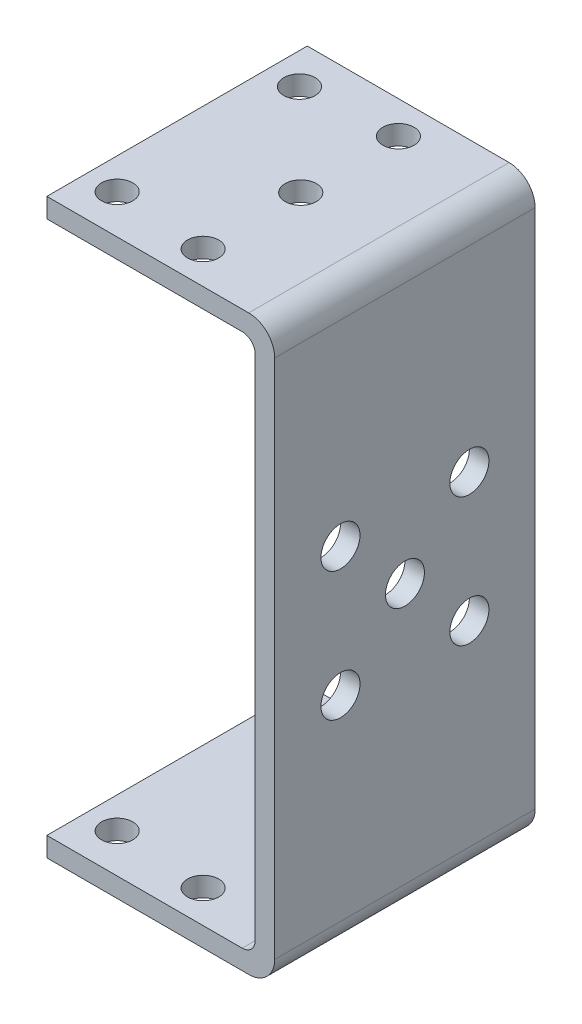
ISO-10303-21;
HEADER;
FILE_DESCRIPTION(('STEP AP214'),'2;1');
FILE_NAME('part.step','',(''),(''),'','','');
FILE_SCHEMA(('AUTOMOTIVE_DESIGN { 1 0 10303 214 1 1 1 1 }'));
ENDSEC;
DATA;
#1=APPLICATION_CONTEXT('core data for automotive mechanical design processes');
#2=APPLICATION_PROTOCOL_DEFINITION('international standard','automotive_design',2000,#1);
#3=PRODUCT_CONTEXT('',#1,'mechanical');
#4=PRODUCT('Part','Part','',(#3));
#5=PRODUCT_RELATED_PRODUCT_CATEGORY('part','',(#4));
#6=PRODUCT_DEFINITION_FORMATION('','',#4);
#7=PRODUCT_DEFINITION_CONTEXT('part definition',#1,'design');
#8=PRODUCT_DEFINITION('design','',#6,#7);
#9=PRODUCT_DEFINITION_SHAPE('','',#8);
#10=(LENGTH_UNIT() NAMED_UNIT(*) SI_UNIT(.MILLI.,.METRE.));
#11=(NAMED_UNIT(*) PLANE_ANGLE_UNIT() SI_UNIT($,.RADIAN.));
#12=(NAMED_UNIT(*) SI_UNIT($,.STERADIAN.) SOLID_ANGLE_UNIT());
#13=UNCERTAINTY_MEASURE_WITH_UNIT(LENGTH_MEASURE(1.E-05),#10,'distance_accuracy_value','');
#14=(GEOMETRIC_REPRESENTATION_CONTEXT(3) GLOBAL_UNCERTAINTY_ASSIGNED_CONTEXT((#13)) GLOBAL_UNIT_ASSIGNED_CONTEXT((#10,
#11,#12)) REPRESENTATION_CONTEXT('',''));
#15=CARTESIAN_POINT('',(0.,0.,0.));
#16=DIRECTION('',(0.,0.,1.));
#17=DIRECTION('',(1.,0.,0.));
#18=AXIS2_PLACEMENT_3D('',#15,#16,#17);
#19=CARTESIAN_POINT('',(0.,1.5,0.));
#20=DIRECTION('',(0.,1.,0.));
#21=DIRECTION('',(0.,0.,1.));
#22=AXIS2_PLACEMENT_3D('',#19,#20,#21);
#23=PLANE('',#22);
#24=CARTESIAN_POINT('',(9.5,1.5,10.));
#25=DIRECTION('',(0.,1.,0.));
#26=DIRECTION('',(0.,0.,1.));
#27=AXIS2_PLACEMENT_3D('',#24,#25,#26);
#28=CIRCLE('',#27,1.2);
#29=CARTESIAN_POINT('',(9.5,1.5,11.2));
#30=VERTEX_POINT('',#29);
#31=EDGE_CURVE('E204',#30,#30,#28,.T.);
#32=ORIENTED_EDGE('',*,*,#31,.F.);
#33=EDGE_LOOP('',(#32));
#34=FACE_BOUND('',#33,.T.);
#35=CARTESIAN_POINT('',(9.5,1.5,2.5));
#36=DIRECTION('',(0.,1.,0.));
#37=DIRECTION('',(0.,0.,1.));
#38=AXIS2_PLACEMENT_3D('',#35,#36,#37);
#39=CIRCLE('',#38,1.2);
#40=CARTESIAN_POINT('',(9.5,1.5,3.7));
#41=VERTEX_POINT('',#40);
#42=EDGE_CURVE('E220',#41,#41,#39,.T.);
#43=ORIENTED_EDGE('',*,*,#42,.F.);
#44=EDGE_LOOP('',(#43));
#45=FACE_BOUND('',#44,.T.);
#46=DIRECTION('',(1.,0.,0.));
#47=VECTOR('',#46,1.);
#48=CARTESIAN_POINT('',(0.,1.5,20.));
#49=LINE('',#48,#47);
#50=CARTESIAN_POINT('',(0.,1.5,20.));
#51=VERTEX_POINT('',#50);
#52=CARTESIAN_POINT('',(15.5,1.5,20.));
#53=VERTEX_POINT('',#52);
#54=EDGE_CURVE('E240',#51,#53,#49,.T.);
#55=ORIENTED_EDGE('',*,*,#54,.T.);
#56=DIRECTION('',(0.,0.,-1.));
#57=VECTOR('',#56,1.);
#58=CARTESIAN_POINT('',(15.5,1.5,0.));
#59=LINE('',#58,#57);
#60=CARTESIAN_POINT('',(15.5,1.5,0.));
#61=VERTEX_POINT('',#60);
#62=EDGE_CURVE('E285',#53,#61,#59,.T.);
#63=ORIENTED_EDGE('',*,*,#62,.T.);
#64=DIRECTION('',(-1.,0.,0.));
#65=VECTOR('',#64,1.);
#66=CARTESIAN_POINT('',(0.,1.5,0.));
#67=LINE('',#66,#65);
#68=CARTESIAN_POINT('',(0.,1.5,0.));
#69=VERTEX_POINT('',#68);
#70=EDGE_CURVE('E245',#61,#69,#67,.T.);
#71=ORIENTED_EDGE('',*,*,#70,.T.);
#72=DIRECTION('',(0.,0.,1.));
#73=VECTOR('',#72,1.);
#74=CARTESIAN_POINT('',(0.,1.5,0.));
#75=LINE('',#74,#73);
#76=EDGE_CURVE('E236',#69,#51,#75,.T.);
#77=ORIENTED_EDGE('',*,*,#76,.T.);
#78=EDGE_LOOP('',(#55,#63,#71,#77));
#79=FACE_BOUND('',#78,.T.);
#80=CARTESIAN_POINT('',(2.4,1.5,3.));
#81=DIRECTION('',(0.,1.,0.));
#82=DIRECTION('',(0.,0.,1.));
#83=AXIS2_PLACEMENT_3D('',#80,#81,#82);
#84=CIRCLE('',#83,1.2);
#85=CARTESIAN_POINT('',(2.4,1.5,4.2));
#86=VERTEX_POINT('',#85);
#87=EDGE_CURVE('E228',#86,#86,#84,.T.);
#88=ORIENTED_EDGE('',*,*,#87,.F.);
#89=EDGE_LOOP('',(#88));
#90=FACE_BOUND('',#89,.T.);
#91=CARTESIAN_POINT('',(2.4,1.5,17.));
#92=DIRECTION('',(0.,1.,0.));
#93=DIRECTION('',(0.,0.,1.));
#94=AXIS2_PLACEMENT_3D('',#91,#92,#93);
#95=CIRCLE('',#94,1.2);
#96=CARTESIAN_POINT('',(2.4,1.5,18.2));
#97=VERTEX_POINT('',#96);
#98=EDGE_CURVE('E212',#97,#97,#95,.T.);
#99=ORIENTED_EDGE('',*,*,#98,.F.);
#100=EDGE_LOOP('',(#99));
#101=FACE_BOUND('',#100,.T.);
#102=CARTESIAN_POINT('',(9.5,1.5,17.5));
#103=DIRECTION('',(0.,1.,0.));
#104=DIRECTION('',(0.,0.,1.));
#105=AXIS2_PLACEMENT_3D('',#102,#103,#104);
#106=CIRCLE('',#105,1.2);
#107=CARTESIAN_POINT('',(9.5,1.5,18.7));
#108=VERTEX_POINT('',#107);
#109=EDGE_CURVE('E196',#108,#108,#106,.T.);
#110=ORIENTED_EDGE('',*,*,#109,.F.);
#111=EDGE_LOOP('',(#110));
#112=FACE_BOUND('',#111,.T.);
#113=ADVANCED_FACE('F45',(#34,#45,#79,#90,#101,#112),#23,.T.);
#114=CARTESIAN_POINT('',(0.,0.,0.));
#115=DIRECTION('',(0.,1.,0.));
#116=DIRECTION('',(0.,0.,1.));
#117=AXIS2_PLACEMENT_3D('',#114,#115,#116);
#118=PLANE('',#117);
#119=DIRECTION('',(-1.,0.,0.));
#120=VECTOR('',#119,1.);
#121=CARTESIAN_POINT('',(0.,0.,0.));
#122=LINE('',#121,#120);
#123=CARTESIAN_POINT('',(15.,0.,0.));
#124=VERTEX_POINT('',#123);
#125=CARTESIAN_POINT('',(0.,0.,0.));
#126=VERTEX_POINT('',#125);
#127=EDGE_CURVE('E241',#124,#126,#122,.T.);
#128=ORIENTED_EDGE('',*,*,#127,.F.);
#129=DIRECTION('',(0.,0.,-1.));
#130=VECTOR('',#129,1.);
#131=CARTESIAN_POINT('',(15.,0.,0.));
#132=LINE('',#131,#130);
#133=CARTESIAN_POINT('',(15.,0.,20.));
#134=VERTEX_POINT('',#133);
#135=EDGE_CURVE('E61',#124,#134,#132,.F.);
#136=ORIENTED_EDGE('',*,*,#135,.T.);
#137=DIRECTION('',(1.,0.,0.));
#138=VECTOR('',#137,1.);
#139=CARTESIAN_POINT('',(0.,0.,20.));
#140=LINE('',#139,#138);
#141=CARTESIAN_POINT('',(0.,0.,20.));
#142=VERTEX_POINT('',#141);
#143=EDGE_CURVE('E252',#142,#134,#140,.T.);
#144=ORIENTED_EDGE('',*,*,#143,.F.);
#145=DIRECTION('',(0.,0.,1.));
#146=VECTOR('',#145,1.);
#147=CARTESIAN_POINT('',(0.,0.,0.));
#148=LINE('',#147,#146);
#149=EDGE_CURVE('E232',#126,#142,#148,.T.);
#150=ORIENTED_EDGE('',*,*,#149,.F.);
#151=EDGE_LOOP('',(#128,#136,#144,#150));
#152=FACE_BOUND('',#151,.T.);
#153=CARTESIAN_POINT('',(2.4,0.,3.));
#154=DIRECTION('',(0.,1.,0.));
#155=DIRECTION('',(0.,0.,1.));
#156=AXIS2_PLACEMENT_3D('',#153,#154,#155);
#157=CIRCLE('',#156,1.2);
#158=CARTESIAN_POINT('',(2.4,0.,4.2));
#159=VERTEX_POINT('',#158);
#160=EDGE_CURVE('E224',#159,#159,#157,.T.);
#161=ORIENTED_EDGE('',*,*,#160,.T.);
#162=EDGE_LOOP('',(#161));
#163=FACE_BOUND('',#162,.T.);
#164=CARTESIAN_POINT('',(9.5,0.,2.5));
#165=DIRECTION('',(0.,1.,0.));
#166=DIRECTION('',(0.,0.,1.));
#167=AXIS2_PLACEMENT_3D('',#164,#165,#166);
#168=CIRCLE('',#167,1.2);
#169=CARTESIAN_POINT('',(9.5,0.,3.7));
#170=VERTEX_POINT('',#169);
#171=EDGE_CURVE('E216',#170,#170,#168,.T.);
#172=ORIENTED_EDGE('',*,*,#171,.T.);
#173=EDGE_LOOP('',(#172));
#174=FACE_BOUND('',#173,.T.);
#175=CARTESIAN_POINT('',(2.4,0.,17.));
#176=DIRECTION('',(0.,1.,0.));
#177=DIRECTION('',(0.,0.,1.));
#178=AXIS2_PLACEMENT_3D('',#175,#176,#177);
#179=CIRCLE('',#178,1.2);
#180=CARTESIAN_POINT('',(2.4,0.,18.2));
#181=VERTEX_POINT('',#180);
#182=EDGE_CURVE('E208',#181,#181,#179,.T.);
#183=ORIENTED_EDGE('',*,*,#182,.T.);
#184=EDGE_LOOP('',(#183));
#185=FACE_BOUND('',#184,.T.);
#186=CARTESIAN_POINT('',(9.5,0.,10.));
#187=DIRECTION('',(0.,1.,0.));
#188=DIRECTION('',(0.,0.,1.));
#189=AXIS2_PLACEMENT_3D('',#186,#187,#188);
#190=CIRCLE('',#189,1.2);
#191=CARTESIAN_POINT('',(9.5,0.,11.2));
#192=VERTEX_POINT('',#191);
#193=EDGE_CURVE('E200',#192,#192,#190,.T.);
#194=ORIENTED_EDGE('',*,*,#193,.T.);
#195=EDGE_LOOP('',(#194));
#196=FACE_BOUND('',#195,.T.);
#197=CARTESIAN_POINT('',(9.5,0.,17.5));
#198=DIRECTION('',(0.,1.,0.));
#199=DIRECTION('',(0.,0.,1.));
#200=AXIS2_PLACEMENT_3D('',#197,#198,#199);
#201=CIRCLE('',#200,1.2);
#202=CARTESIAN_POINT('',(9.5,0.,18.7));
#203=VERTEX_POINT('',#202);
#204=EDGE_CURVE('E190',#203,#203,#201,.T.);
#205=ORIENTED_EDGE('',*,*,#204,.T.);
#206=EDGE_LOOP('',(#205));
#207=FACE_BOUND('',#206,.T.);
#208=ADVANCED_FACE('F327',(#152,#163,#174,#185,#196,#207),#118,.F.);
#209=CARTESIAN_POINT('',(0.,1.5,0.));
#210=DIRECTION('',(1.,0.,0.));
#211=DIRECTION('',(0.,0.,-1.));
#212=AXIS2_PLACEMENT_3D('',#209,#210,#211);
#213=PLANE('',#212);
#214=ORIENTED_EDGE('',*,*,#149,.T.);
#215=DIRECTION('',(0.,-1.,0.));
#216=VECTOR('',#215,1.);
#217=CARTESIAN_POINT('',(0.,1.5,20.));
#218=LINE('',#217,#216);
#219=EDGE_CURVE('E260',#51,#142,#218,.T.);
#220=ORIENTED_EDGE('',*,*,#219,.F.);
#221=ORIENTED_EDGE('',*,*,#76,.F.);
#222=DIRECTION('',(0.,-1.,0.));
#223=VECTOR('',#222,1.);
#224=CARTESIAN_POINT('',(0.,1.5,0.));
#225=LINE('',#224,#223);
#226=EDGE_CURVE('E248',#69,#126,#225,.T.);
#227=ORIENTED_EDGE('',*,*,#226,.T.);
#228=EDGE_LOOP('',(#214,#220,#221,#227));
#229=FACE_BOUND('',#228,.T.);
#230=ADVANCED_FACE('F330',(#229),#213,.F.);
#231=CARTESIAN_POINT('',(0.,1.5,20.));
#232=DIRECTION('',(0.,0.,-1.));
#233=DIRECTION('',(-1.,0.,0.));
#234=AXIS2_PLACEMENT_3D('',#231,#232,#233);
#235=PLANE('',#234);
#236=DIRECTION('',(1.,0.,0.));
#237=VECTOR('',#236,1.);
#238=CARTESIAN_POINT('',(0.,-42.5,20.));
#239=LINE('',#238,#237);
#240=CARTESIAN_POINT('',(0.,-42.5,20.));
#241=VERTEX_POINT('',#240);
#242=CARTESIAN_POINT('',(15.5,-42.5,20.));
#243=VERTEX_POINT('',#242);
#244=EDGE_CURVE('E136',#241,#243,#239,.T.);
#245=ORIENTED_EDGE('',*,*,#244,.T.);
#246=CARTESIAN_POINT('',(15.5,-40.5,20.));
#247=DIRECTION('',(0.,0.,-1.));
#248=DIRECTION('',(-1.,0.,0.));
#249=AXIS2_PLACEMENT_3D('',#246,#247,#248);
#250=CIRCLE('',#249,2.);
#251=CARTESIAN_POINT('',(17.5,-40.5,20.));
#252=VERTEX_POINT('',#251);
#253=EDGE_CURVE('E282',#243,#252,#250,.F.);
#254=ORIENTED_EDGE('',*,*,#253,.T.);
#255=DIRECTION('',(0.,-1.,0.));
#256=VECTOR('',#255,1.);
#257=CARTESIAN_POINT('',(17.5,0.,20.));
#258=LINE('',#257,#256);
#259=CARTESIAN_POINT('',(17.5,-0.5,20.));
#260=VERTEX_POINT('',#259);
#261=EDGE_CURVE('E185',#260,#252,#258,.T.);
#262=ORIENTED_EDGE('',*,*,#261,.F.);
#263=CARTESIAN_POINT('',(15.5,-0.5,20.));
#264=DIRECTION('',(0.,0.,-1.));
#265=DIRECTION('',(-1.,0.,0.));
#266=AXIS2_PLACEMENT_3D('',#263,#264,#265);
#267=CIRCLE('',#266,2.);
#268=EDGE_CURVE('E279',#260,#53,#267,.F.);
#269=ORIENTED_EDGE('',*,*,#268,.T.);
#270=ORIENTED_EDGE('',*,*,#54,.F.);
#271=ORIENTED_EDGE('',*,*,#219,.T.);
#272=ORIENTED_EDGE('',*,*,#143,.T.);
#273=CARTESIAN_POINT('',(15.,-1.,20.));
#274=DIRECTION('',(0.,0.,-1.));
#275=DIRECTION('',(-1.,0.,0.));
#276=AXIS2_PLACEMENT_3D('',#273,#274,#275);
#277=CIRCLE('',#276,1.);
#278=CARTESIAN_POINT('',(16.,-1.,20.));
#279=VERTEX_POINT('',#278);
#280=EDGE_CURVE('E11',#134,#279,#277,.T.);
#281=ORIENTED_EDGE('',*,*,#280,.T.);
#282=DIRECTION('',(0.,1.,0.));
#283=VECTOR('',#282,1.);
#284=CARTESIAN_POINT('',(16.,0.,20.));
#285=LINE('',#284,#283);
#286=CARTESIAN_POINT('',(16.,-40.,20.));
#287=VERTEX_POINT('',#286);
#288=EDGE_CURVE('E181',#287,#279,#285,.T.);
#289=ORIENTED_EDGE('',*,*,#288,.F.);
#290=CARTESIAN_POINT('',(15.,-40.,20.));
#291=DIRECTION('',(0.,0.,-1.));
#292=DIRECTION('',(-1.,0.,0.));
#293=AXIS2_PLACEMENT_3D('',#290,#291,#292);
#294=CIRCLE('',#293,1.);
#295=CARTESIAN_POINT('',(15.,-41.,20.));
#296=VERTEX_POINT('',#295);
#297=EDGE_CURVE('E305',#287,#296,#294,.T.);
#298=ORIENTED_EDGE('',*,*,#297,.T.);
#299=DIRECTION('',(1.,0.,0.));
#300=VECTOR('',#299,1.);
#301=CARTESIAN_POINT('',(0.,-41.,20.));
#302=LINE('',#301,#300);
#303=CARTESIAN_POINT('',(0.,-41.,20.));
#304=VERTEX_POINT('',#303);
#305=EDGE_CURVE('E139',#304,#296,#302,.T.);
#306=ORIENTED_EDGE('',*,*,#305,.F.);
#307=DIRECTION('',(0.,1.,0.));
#308=VECTOR('',#307,1.);
#309=CARTESIAN_POINT('',(0.,-42.5,20.));
#310=LINE('',#309,#308);
#311=EDGE_CURVE('E133',#241,#304,#310,.T.);
#312=ORIENTED_EDGE('',*,*,#311,.F.);
#313=EDGE_LOOP('',(#245,#254,#262,#269,#270,#271,#272,#281,#289,#298,#306,#312));
#314=FACE_BOUND('',#313,.T.);
#315=ADVANCED_FACE('F135',(#314),#235,.F.);
#316=CARTESIAN_POINT('',(0.,1.5,0.));
#317=DIRECTION('',(0.,0.,1.));
#318=DIRECTION('',(1.,0.,0.));
#319=AXIS2_PLACEMENT_3D('',#316,#317,#318);
#320=PLANE('',#319);
#321=DIRECTION('',(0.,-1.,0.));
#322=VECTOR('',#321,1.);
#323=CARTESIAN_POINT('',(17.5,0.,0.));
#324=LINE('',#323,#322);
#325=CARTESIAN_POINT('',(17.5,-0.5,0.));
#326=VERTEX_POINT('',#325);
#327=CARTESIAN_POINT('',(17.5,-40.5,0.));
#328=VERTEX_POINT('',#327);
#329=EDGE_CURVE('E186',#326,#328,#324,.T.);
#330=ORIENTED_EDGE('',*,*,#329,.T.);
#331=CARTESIAN_POINT('',(15.5,-40.5,0.));
#332=DIRECTION('',(0.,0.,1.));
#333=DIRECTION('',(1.,0.,0.));
#334=AXIS2_PLACEMENT_3D('',#331,#332,#333);
#335=CIRCLE('',#334,2.);
#336=CARTESIAN_POINT('',(15.5,-42.5,0.));
#337=VERTEX_POINT('',#336);
#338=EDGE_CURVE('E274',#328,#337,#335,.F.);
#339=ORIENTED_EDGE('',*,*,#338,.T.);
#340=DIRECTION('',(-1.,0.,0.));
#341=VECTOR('',#340,1.);
#342=CARTESIAN_POINT('',(0.,-42.5,0.));
#343=LINE('',#342,#341);
#344=CARTESIAN_POINT('',(0.,-42.5,0.));
#345=VERTEX_POINT('',#344);
#346=EDGE_CURVE('E157',#337,#345,#343,.T.);
#347=ORIENTED_EDGE('',*,*,#346,.T.);
#348=DIRECTION('',(0.,1.,0.));
#349=VECTOR('',#348,1.);
#350=CARTESIAN_POINT('',(0.,-42.5,0.));
#351=LINE('',#350,#349);
#352=CARTESIAN_POINT('',(0.,-41.,0.));
#353=VERTEX_POINT('',#352);
#354=EDGE_CURVE('E146',#345,#353,#351,.T.);
#355=ORIENTED_EDGE('',*,*,#354,.T.);
#356=DIRECTION('',(-1.,0.,0.));
#357=VECTOR('',#356,1.);
#358=CARTESIAN_POINT('',(0.,-41.,0.));
#359=LINE('',#358,#357);
#360=CARTESIAN_POINT('',(15.,-41.,0.));
#361=VERTEX_POINT('',#360);
#362=EDGE_CURVE('E163',#361,#353,#359,.T.);
#363=ORIENTED_EDGE('',*,*,#362,.F.);
#364=CARTESIAN_POINT('',(15.,-40.,0.));
#365=DIRECTION('',(0.,0.,1.));
#366=DIRECTION('',(1.,0.,0.));
#367=AXIS2_PLACEMENT_3D('',#364,#365,#366);
#368=CIRCLE('',#367,1.);
#369=CARTESIAN_POINT('',(16.,-40.,0.));
#370=VERTEX_POINT('',#369);
#371=EDGE_CURVE('E302',#361,#370,#368,.T.);
#372=ORIENTED_EDGE('',*,*,#371,.T.);
#373=DIRECTION('',(0.,1.,0.));
#374=VECTOR('',#373,1.);
#375=CARTESIAN_POINT('',(16.,0.,0.));
#376=LINE('',#375,#374);
#377=CARTESIAN_POINT('',(16.,-1.,0.));
#378=VERTEX_POINT('',#377);
#379=EDGE_CURVE('E145',#370,#378,#376,.T.);
#380=ORIENTED_EDGE('',*,*,#379,.T.);
#381=CARTESIAN_POINT('',(15.,-1.,0.));
#382=DIRECTION('',(0.,0.,1.));
#383=DIRECTION('',(1.,0.,0.));
#384=AXIS2_PLACEMENT_3D('',#381,#382,#383);
#385=CIRCLE('',#384,1.);
#386=EDGE_CURVE('E54',#378,#124,#385,.T.);
#387=ORIENTED_EDGE('',*,*,#386,.T.);
#388=ORIENTED_EDGE('',*,*,#127,.T.);
#389=ORIENTED_EDGE('',*,*,#226,.F.);
#390=ORIENTED_EDGE('',*,*,#70,.F.);
#391=CARTESIAN_POINT('',(15.5,-0.5,0.));
#392=DIRECTION('',(0.,0.,1.));
#393=DIRECTION('',(1.,0.,0.));
#394=AXIS2_PLACEMENT_3D('',#391,#392,#393);
#395=CIRCLE('',#394,2.);
#396=EDGE_CURVE('E271',#61,#326,#395,.F.);
#397=ORIENTED_EDGE('',*,*,#396,.T.);
#398=EDGE_LOOP('',(#330,#339,#347,#355,#363,#372,#380,#387,#388,#389,#390,#397));
#399=FACE_BOUND('',#398,.T.);
#400=ADVANCED_FACE('F319',(#399),#320,.F.);
#401=CARTESIAN_POINT('',(2.4,1.5,3.));
#402=DIRECTION('',(0.,-1.,0.));
#403=DIRECTION('',(0.,0.,-1.));
#404=AXIS2_PLACEMENT_3D('',#401,#402,#403);
#405=CYLINDRICAL_SURFACE('',#404,1.2);
#406=ORIENTED_EDGE('',*,*,#87,.T.);
#407=EDGE_LOOP('',(#406));
#408=FACE_BOUND('',#407,.T.);
#409=ORIENTED_EDGE('',*,*,#160,.F.);
#410=EDGE_LOOP('',(#409));
#411=FACE_BOUND('',#410,.T.);
#412=ADVANCED_FACE('F370',(#408,#411),#405,.F.);
#413=CARTESIAN_POINT('',(9.5,1.5,2.5));
#414=DIRECTION('',(0.,-1.,0.));
#415=DIRECTION('',(0.,0.,-1.));
#416=AXIS2_PLACEMENT_3D('',#413,#414,#415);
#417=CYLINDRICAL_SURFACE('',#416,1.2);
#418=ORIENTED_EDGE('',*,*,#42,.T.);
#419=EDGE_LOOP('',(#418));
#420=FACE_BOUND('',#419,.T.);
#421=ORIENTED_EDGE('',*,*,#171,.F.);
#422=EDGE_LOOP('',(#421));
#423=FACE_BOUND('',#422,.T.);
#424=ADVANCED_FACE('F398',(#420,#423),#417,.F.);
#425=CARTESIAN_POINT('',(2.4,1.5,17.));
#426=DIRECTION('',(0.,-1.,0.));
#427=DIRECTION('',(0.,0.,-1.));
#428=AXIS2_PLACEMENT_3D('',#425,#426,#427);
#429=CYLINDRICAL_SURFACE('',#428,1.2);
#430=ORIENTED_EDGE('',*,*,#98,.T.);
#431=EDGE_LOOP('',(#430));
#432=FACE_BOUND('',#431,.T.);
#433=ORIENTED_EDGE('',*,*,#182,.F.);
#434=EDGE_LOOP('',(#433));
#435=FACE_BOUND('',#434,.T.);
#436=ADVANCED_FACE('F406',(#432,#435),#429,.F.);
#437=CARTESIAN_POINT('',(9.5,1.5,10.));
#438=DIRECTION('',(0.,-1.,0.));
#439=DIRECTION('',(0.,0.,-1.));
#440=AXIS2_PLACEMENT_3D('',#437,#438,#439);
#441=CYLINDRICAL_SURFACE('',#440,1.2);
#442=ORIENTED_EDGE('',*,*,#31,.T.);
#443=EDGE_LOOP('',(#442));
#444=FACE_BOUND('',#443,.T.);
#445=ORIENTED_EDGE('',*,*,#193,.F.);
#446=EDGE_LOOP('',(#445));
#447=FACE_BOUND('',#446,.T.);
#448=ADVANCED_FACE('F413',(#444,#447),#441,.F.);
#449=CARTESIAN_POINT('',(9.5,1.5,17.5));
#450=DIRECTION('',(0.,-1.,0.));
#451=DIRECTION('',(0.,0.,-1.));
#452=AXIS2_PLACEMENT_3D('',#449,#450,#451);
#453=CYLINDRICAL_SURFACE('',#452,1.2);
#454=ORIENTED_EDGE('',*,*,#109,.T.);
#455=EDGE_LOOP('',(#454));
#456=FACE_BOUND('',#455,.T.);
#457=ORIENTED_EDGE('',*,*,#204,.F.);
#458=EDGE_LOOP('',(#457));
#459=FACE_BOUND('',#458,.T.);
#460=ADVANCED_FACE('F421',(#456,#459),#453,.F.);
#461=CARTESIAN_POINT('',(16.,0.,20.));
#462=DIRECTION('',(-1.,0.,0.));
#463=DIRECTION('',(0.,0.,1.));
#464=AXIS2_PLACEMENT_3D('',#461,#462,#463);
#465=PLANE('',#464);
#466=CARTESIAN_POINT('',(16.,-25.4497474683058,14.9497474683058));
#467=DIRECTION('',(-1.,0.,0.));
#468=DIRECTION('',(0.,0.,1.));
#469=AXIS2_PLACEMENT_3D('',#466,#467,#468);
#470=CIRCLE('',#469,1.5);
#471=CARTESIAN_POINT('',(16.,-25.4497474683058,16.4497474683058));
#472=VERTEX_POINT('',#471);
#473=EDGE_CURVE('E747',#472,#472,#470,.T.);
#474=ORIENTED_EDGE('',*,*,#473,.F.);
#475=EDGE_LOOP('',(#474));
#476=FACE_BOUND('',#475,.T.);
#477=CARTESIAN_POINT('',(16.,-25.4497474683058,5.05025253169417));
#478=DIRECTION('',(-1.,0.,0.));
#479=DIRECTION('',(0.,0.,1.));
#480=AXIS2_PLACEMENT_3D('',#477,#478,#479);
#481=CIRCLE('',#480,1.5);
#482=CARTESIAN_POINT('',(16.,-25.4497474683058,6.55025253169417));
#483=VERTEX_POINT('',#482);
#484=EDGE_CURVE('E711',#483,#483,#481,.T.);
#485=ORIENTED_EDGE('',*,*,#484,.F.);
#486=EDGE_LOOP('',(#485));
#487=FACE_BOUND('',#486,.T.);
#488=CARTESIAN_POINT('',(16.,-15.5502525316942,5.05025253169416));
#489=DIRECTION('',(-1.,0.,0.));
#490=DIRECTION('',(0.,0.,1.));
#491=AXIS2_PLACEMENT_3D('',#488,#489,#490);
#492=CIRCLE('',#491,1.5);
#493=CARTESIAN_POINT('',(16.,-15.5502525316942,6.55025253169417));
#494=VERTEX_POINT('',#493);
#495=EDGE_CURVE('E741',#494,#494,#492,.T.);
#496=ORIENTED_EDGE('',*,*,#495,.F.);
#497=EDGE_LOOP('',(#496));
#498=FACE_BOUND('',#497,.T.);
#499=CARTESIAN_POINT('',(16.,-15.5502525316942,14.9497474683058));
#500=DIRECTION('',(-1.,0.,0.));
#501=DIRECTION('',(0.,0.,1.));
#502=AXIS2_PLACEMENT_3D('',#499,#500,#501);
#503=CIRCLE('',#502,1.5);
#504=CARTESIAN_POINT('',(16.,-15.5502525316942,16.4497474683058));
#505=VERTEX_POINT('',#504);
#506=EDGE_CURVE('E737',#505,#505,#503,.T.);
#507=ORIENTED_EDGE('',*,*,#506,.F.);
#508=EDGE_LOOP('',(#507));
#509=FACE_BOUND('',#508,.T.);
#510=CARTESIAN_POINT('',(16.,-20.5,10.));
#511=DIRECTION('',(-1.,0.,0.));
#512=DIRECTION('',(0.,0.,1.));
#513=AXIS2_PLACEMENT_3D('',#510,#511,#512);
#514=CIRCLE('',#513,1.5);
#515=CARTESIAN_POINT('',(16.,-20.5,11.5));
#516=VERTEX_POINT('',#515);
#517=EDGE_CURVE('E733',#516,#516,#514,.T.);
#518=ORIENTED_EDGE('',*,*,#517,.F.);
#519=EDGE_LOOP('',(#518));
#520=FACE_BOUND('',#519,.T.);
#521=ORIENTED_EDGE('',*,*,#379,.F.);
#522=DIRECTION('',(0.,0.,-1.));
#523=VECTOR('',#522,1.);
#524=CARTESIAN_POINT('',(16.,-40.,20.));
#525=LINE('',#524,#523);
#526=EDGE_CURVE('E297',#370,#287,#525,.F.);
#527=ORIENTED_EDGE('',*,*,#526,.T.);
#528=ORIENTED_EDGE('',*,*,#288,.T.);
#529=DIRECTION('',(0.,0.,-1.));
#530=VECTOR('',#529,1.);
#531=CARTESIAN_POINT('',(16.,-1.,20.));
#532=LINE('',#531,#530);
#533=EDGE_CURVE('E293',#279,#378,#532,.T.);
#534=ORIENTED_EDGE('',*,*,#533,.T.);
#535=EDGE_LOOP('',(#521,#527,#528,#534));
#536=FACE_BOUND('',#535,.T.);
#537=ADVANCED_FACE('F321',(#476,#487,#498,#509,#520,#536),#465,.T.);
#538=CARTESIAN_POINT('',(17.5,0.,20.));
#539=DIRECTION('',(1.,0.,0.));
#540=DIRECTION('',(0.,1.,0.));
#541=AXIS2_PLACEMENT_3D('',#538,#539,#540);
#542=PLANE('',#541);
#543=CARTESIAN_POINT('',(17.5,-25.4497474683058,14.9497474683058));
#544=DIRECTION('',(1.,0.,0.));
#545=DIRECTION('',(0.,1.,0.));
#546=AXIS2_PLACEMENT_3D('',#543,#544,#545);
#547=CIRCLE('',#546,1.5);
#548=CARTESIAN_POINT('',(17.5,-23.9497474683058,14.9497474683058));
#549=VERTEX_POINT('',#548);
#550=EDGE_CURVE('E718',#549,#549,#547,.T.);
#551=ORIENTED_EDGE('',*,*,#550,.F.);
#552=EDGE_LOOP('',(#551));
#553=FACE_BOUND('',#552,.T.);
#554=CARTESIAN_POINT('',(17.5,-25.4497474683058,5.05025253169417));
#555=DIRECTION('',(1.,0.,0.));
#556=DIRECTION('',(0.,1.,0.));
#557=AXIS2_PLACEMENT_3D('',#554,#555,#556);
#558=CIRCLE('',#557,1.5);
#559=CARTESIAN_POINT('',(17.5,-23.9497474683058,5.05025253169417));
#560=VERTEX_POINT('',#559);
#561=EDGE_CURVE('E714',#560,#560,#558,.T.);
#562=ORIENTED_EDGE('',*,*,#561,.F.);
#563=EDGE_LOOP('',(#562));
#564=FACE_BOUND('',#563,.T.);
#565=CARTESIAN_POINT('',(17.5,-15.5502525316942,5.05025253169416));
#566=DIRECTION('',(1.,0.,0.));
#567=DIRECTION('',(0.,1.,0.));
#568=AXIS2_PLACEMENT_3D('',#565,#566,#567);
#569=CIRCLE('',#568,1.5);
#570=CARTESIAN_POINT('',(17.5,-14.0502525316942,5.05025253169416));
#571=VERTEX_POINT('',#570);
#572=EDGE_CURVE('E717',#571,#571,#569,.T.);
#573=ORIENTED_EDGE('',*,*,#572,.F.);
#574=EDGE_LOOP('',(#573));
#575=FACE_BOUND('',#574,.T.);
#576=CARTESIAN_POINT('',(17.5,-15.5502525316942,14.9497474683058));
#577=DIRECTION('',(1.,0.,0.));
#578=DIRECTION('',(0.,1.,0.));
#579=AXIS2_PLACEMENT_3D('',#576,#577,#578);
#580=CIRCLE('',#579,1.5);
#581=CARTESIAN_POINT('',(17.5,-14.0502525316942,14.9497474683058));
#582=VERTEX_POINT('',#581);
#583=EDGE_CURVE('E723',#582,#582,#580,.T.);
#584=ORIENTED_EDGE('',*,*,#583,.F.);
#585=EDGE_LOOP('',(#584));
#586=FACE_BOUND('',#585,.T.);
#587=CARTESIAN_POINT('',(17.5,-20.5,10.));
#588=DIRECTION('',(1.,0.,0.));
#589=DIRECTION('',(0.,1.,0.));
#590=AXIS2_PLACEMENT_3D('',#587,#588,#589);
#591=CIRCLE('',#590,1.5);
#592=CARTESIAN_POINT('',(17.5,-19.,10.));
#593=VERTEX_POINT('',#592);
#594=EDGE_CURVE('E729',#593,#593,#591,.T.);
#595=ORIENTED_EDGE('',*,*,#594,.F.);
#596=EDGE_LOOP('',(#595));
#597=FACE_BOUND('',#596,.T.);
#598=ORIENTED_EDGE('',*,*,#261,.T.);
#599=DIRECTION('',(0.,0.,-1.));
#600=VECTOR('',#599,1.);
#601=CARTESIAN_POINT('',(17.5,-40.5,20.));
#602=LINE('',#601,#600);
#603=EDGE_CURVE('E267',#252,#328,#602,.T.);
#604=ORIENTED_EDGE('',*,*,#603,.T.);
#605=ORIENTED_EDGE('',*,*,#329,.F.);
#606=DIRECTION('',(0.,0.,-1.));
#607=VECTOR('',#606,1.);
#608=CARTESIAN_POINT('',(17.5,-0.5,20.));
#609=LINE('',#608,#607);
#610=EDGE_CURVE('E264',#326,#260,#609,.F.);
#611=ORIENTED_EDGE('',*,*,#610,.T.);
#612=EDGE_LOOP('',(#598,#604,#605,#611));
#613=FACE_BOUND('',#612,.T.);
#614=ADVANCED_FACE('F344',(#553,#564,#575,#586,#597,#613),#542,.T.);
#615=CARTESIAN_POINT('',(0.,-42.5,0.));
#616=DIRECTION('',(0.,-1.,0.));
#617=DIRECTION('',(0.,0.,1.));
#618=AXIS2_PLACEMENT_3D('',#615,#616,#617);
#619=PLANE('',#618);
#620=CARTESIAN_POINT('',(9.5,-42.5,10.));
#621=DIRECTION('',(0.,1.,0.));
#622=DIRECTION('',(0.,0.,1.));
#623=AXIS2_PLACEMENT_3D('',#620,#621,#622);
#624=CIRCLE('',#623,1.2);
#625=CARTESIAN_POINT('',(9.5,-42.5,11.2));
#626=VERTEX_POINT('',#625);
#627=EDGE_CURVE('E760',#626,#626,#624,.T.);
#628=ORIENTED_EDGE('',*,*,#627,.T.);
#629=EDGE_LOOP('',(#628));
#630=FACE_BOUND('',#629,.T.);
#631=CARTESIAN_POINT('',(9.5,-42.5,2.5));
#632=DIRECTION('',(0.,1.,0.));
#633=DIRECTION('',(0.,0.,1.));
#634=AXIS2_PLACEMENT_3D('',#631,#632,#633);
#635=CIRCLE('',#634,1.2);
#636=CARTESIAN_POINT('',(9.5,-42.5,3.7));
#637=VERTEX_POINT('',#636);
#638=EDGE_CURVE('E776',#637,#637,#635,.T.);
#639=ORIENTED_EDGE('',*,*,#638,.T.);
#640=EDGE_LOOP('',(#639));
#641=FACE_BOUND('',#640,.T.);
#642=ORIENTED_EDGE('',*,*,#346,.F.);
#643=DIRECTION('',(0.,0.,-1.));
#644=VECTOR('',#643,1.);
#645=CARTESIAN_POINT('',(15.5,-42.5,0.));
#646=LINE('',#645,#644);
#647=EDGE_CURVE('E155',#337,#243,#646,.F.);
#648=ORIENTED_EDGE('',*,*,#647,.T.);
#649=ORIENTED_EDGE('',*,*,#244,.F.);
#650=DIRECTION('',(0.,0.,1.));
#651=VECTOR('',#650,1.);
#652=CARTESIAN_POINT('',(0.,-42.5,0.));
#653=LINE('',#652,#651);
#654=EDGE_CURVE('E153',#345,#241,#653,.T.);
#655=ORIENTED_EDGE('',*,*,#654,.F.);
#656=EDGE_LOOP('',(#642,#648,#649,#655));
#657=FACE_BOUND('',#656,.T.);
#658=CARTESIAN_POINT('',(2.4,-42.5,3.));
#659=DIRECTION('',(0.,1.,0.));
#660=DIRECTION('',(0.,0.,1.));
#661=AXIS2_PLACEMENT_3D('',#658,#659,#660);
#662=CIRCLE('',#661,1.2);
#663=CARTESIAN_POINT('',(2.4,-42.5,4.2));
#664=VERTEX_POINT('',#663);
#665=EDGE_CURVE('E176',#664,#664,#662,.T.);
#666=ORIENTED_EDGE('',*,*,#665,.T.);
#667=EDGE_LOOP('',(#666));
#668=FACE_BOUND('',#667,.T.);
#669=CARTESIAN_POINT('',(2.4,-42.5,17.));
#670=DIRECTION('',(0.,1.,0.));
#671=DIRECTION('',(0.,0.,1.));
#672=AXIS2_PLACEMENT_3D('',#669,#670,#671);
#673=CIRCLE('',#672,1.2);
#674=CARTESIAN_POINT('',(2.4,-42.5,18.2));
#675=VERTEX_POINT('',#674);
#676=EDGE_CURVE('E768',#675,#675,#673,.T.);
#677=ORIENTED_EDGE('',*,*,#676,.T.);
#678=EDGE_LOOP('',(#677));
#679=FACE_BOUND('',#678,.T.);
#680=CARTESIAN_POINT('',(9.5,-42.5,17.5));
#681=DIRECTION('',(0.,1.,0.));
#682=DIRECTION('',(0.,0.,1.));
#683=AXIS2_PLACEMENT_3D('',#680,#681,#682);
#684=CIRCLE('',#683,1.2);
#685=CARTESIAN_POINT('',(9.5,-42.5,18.7));
#686=VERTEX_POINT('',#685);
#687=EDGE_CURVE('E752',#686,#686,#684,.T.);
#688=ORIENTED_EDGE('',*,*,#687,.T.);
#689=EDGE_LOOP('',(#688));
#690=FACE_BOUND('',#689,.T.);
#691=ADVANCED_FACE('F151',(#630,#641,#657,#668,#679,#690),#619,.T.);
#692=CARTESIAN_POINT('',(0.,-41.,0.));
#693=DIRECTION('',(0.,-1.,0.));
#694=DIRECTION('',(0.,0.,1.));
#695=AXIS2_PLACEMENT_3D('',#692,#693,#694);
#696=PLANE('',#695);
#697=ORIENTED_EDGE('',*,*,#305,.T.);
#698=DIRECTION('',(0.,0.,-1.));
#699=VECTOR('',#698,1.);
#700=CARTESIAN_POINT('',(15.,-41.,0.));
#701=LINE('',#700,#699);
#702=EDGE_CURVE('E289',#296,#361,#701,.T.);
#703=ORIENTED_EDGE('',*,*,#702,.T.);
#704=ORIENTED_EDGE('',*,*,#362,.T.);
#705=DIRECTION('',(0.,0.,1.));
#706=VECTOR('',#705,1.);
#707=CARTESIAN_POINT('',(0.,-41.,0.));
#708=LINE('',#707,#706);
#709=EDGE_CURVE('E173',#353,#304,#708,.T.);
#710=ORIENTED_EDGE('',*,*,#709,.T.);
#711=EDGE_LOOP('',(#697,#703,#704,#710));
#712=FACE_BOUND('',#711,.T.);
#713=CARTESIAN_POINT('',(2.4,-41.,3.));
#714=DIRECTION('',(0.,1.,0.));
#715=DIRECTION('',(0.,0.,1.));
#716=AXIS2_PLACEMENT_3D('',#713,#714,#715);
#717=CIRCLE('',#716,1.2);
#718=CARTESIAN_POINT('',(2.4,-41.,4.2));
#719=VERTEX_POINT('',#718);
#720=EDGE_CURVE('E168',#719,#719,#717,.T.);
#721=ORIENTED_EDGE('',*,*,#720,.F.);
#722=EDGE_LOOP('',(#721));
#723=FACE_BOUND('',#722,.T.);
#724=CARTESIAN_POINT('',(9.5,-41.,2.5));
#725=DIRECTION('',(0.,1.,0.));
#726=DIRECTION('',(0.,0.,1.));
#727=AXIS2_PLACEMENT_3D('',#724,#725,#726);
#728=CIRCLE('',#727,1.2);
#729=CARTESIAN_POINT('',(9.5,-41.,3.7));
#730=VERTEX_POINT('',#729);
#731=EDGE_CURVE('E772',#730,#730,#728,.T.);
#732=ORIENTED_EDGE('',*,*,#731,.F.);
#733=EDGE_LOOP('',(#732));
#734=FACE_BOUND('',#733,.T.);
#735=CARTESIAN_POINT('',(2.4,-41.,17.));
#736=DIRECTION('',(0.,1.,0.));
#737=DIRECTION('',(0.,0.,1.));
#738=AXIS2_PLACEMENT_3D('',#735,#736,#737);
#739=CIRCLE('',#738,1.2);
#740=CARTESIAN_POINT('',(2.4,-41.,18.2));
#741=VERTEX_POINT('',#740);
#742=EDGE_CURVE('E764',#741,#741,#739,.T.);
#743=ORIENTED_EDGE('',*,*,#742,.F.);
#744=EDGE_LOOP('',(#743));
#745=FACE_BOUND('',#744,.T.);
#746=CARTESIAN_POINT('',(9.5,-41.,10.));
#747=DIRECTION('',(0.,1.,0.));
#748=DIRECTION('',(0.,0.,1.));
#749=AXIS2_PLACEMENT_3D('',#746,#747,#748);
#750=CIRCLE('',#749,1.2);
#751=CARTESIAN_POINT('',(9.5,-41.,11.2));
#752=VERTEX_POINT('',#751);
#753=EDGE_CURVE('E756',#752,#752,#750,.T.);
#754=ORIENTED_EDGE('',*,*,#753,.F.);
#755=EDGE_LOOP('',(#754));
#756=FACE_BOUND('',#755,.T.);
#757=CARTESIAN_POINT('',(9.5,-41.,17.5));
#758=DIRECTION('',(0.,1.,0.));
#759=DIRECTION('',(0.,0.,1.));
#760=AXIS2_PLACEMENT_3D('',#757,#758,#759);
#761=CIRCLE('',#760,1.2);
#762=CARTESIAN_POINT('',(9.5,-41.,18.7));
#763=VERTEX_POINT('',#762);
#764=EDGE_CURVE('E751',#763,#763,#761,.T.);
#765=ORIENTED_EDGE('',*,*,#764,.F.);
#766=EDGE_LOOP('',(#765));
#767=FACE_BOUND('',#766,.T.);
#768=ADVANCED_FACE('F314',(#712,#723,#734,#745,#756,#767),#696,.F.);
#769=CARTESIAN_POINT('',(0.,-42.5,0.));
#770=DIRECTION('',(1.,0.,0.));
#771=DIRECTION('',(0.,0.,-1.));
#772=AXIS2_PLACEMENT_3D('',#769,#770,#771);
#773=PLANE('',#772);
#774=ORIENTED_EDGE('',*,*,#709,.F.);
#775=ORIENTED_EDGE('',*,*,#354,.F.);
#776=ORIENTED_EDGE('',*,*,#654,.T.);
#777=ORIENTED_EDGE('',*,*,#311,.T.);
#778=EDGE_LOOP('',(#774,#775,#776,#777));
#779=FACE_BOUND('',#778,.T.);
#780=ADVANCED_FACE('F160',(#779),#773,.F.);
#781=CARTESIAN_POINT('',(2.4,-42.5,3.));
#782=DIRECTION('',(0.,1.,0.));
#783=DIRECTION('',(0.,0.,-1.));
#784=AXIS2_PLACEMENT_3D('',#781,#782,#783);
#785=CYLINDRICAL_SURFACE('',#784,1.2);
#786=ORIENTED_EDGE('',*,*,#665,.F.);
#787=EDGE_LOOP('',(#786));
#788=FACE_BOUND('',#787,.T.);
#789=ORIENTED_EDGE('',*,*,#720,.T.);
#790=EDGE_LOOP('',(#789));
#791=FACE_BOUND('',#790,.T.);
#792=ADVANCED_FACE('F462',(#788,#791),#785,.F.);
#793=CARTESIAN_POINT('',(9.5,-42.5,2.5));
#794=DIRECTION('',(0.,1.,0.));
#795=DIRECTION('',(0.,0.,-1.));
#796=AXIS2_PLACEMENT_3D('',#793,#794,#795);
#797=CYLINDRICAL_SURFACE('',#796,1.2);
#798=ORIENTED_EDGE('',*,*,#638,.F.);
#799=EDGE_LOOP('',(#798));
#800=FACE_BOUND('',#799,.T.);
#801=ORIENTED_EDGE('',*,*,#731,.T.);
#802=EDGE_LOOP('',(#801));
#803=FACE_BOUND('',#802,.T.);
#804=ADVANCED_FACE('F470',(#800,#803),#797,.F.);
#805=CARTESIAN_POINT('',(2.4,-42.5,17.));
#806=DIRECTION('',(0.,1.,0.));
#807=DIRECTION('',(0.,0.,-1.));
#808=AXIS2_PLACEMENT_3D('',#805,#806,#807);
#809=CYLINDRICAL_SURFACE('',#808,1.2);
#810=ORIENTED_EDGE('',*,*,#676,.F.);
#811=EDGE_LOOP('',(#810));
#812=FACE_BOUND('',#811,.T.);
#813=ORIENTED_EDGE('',*,*,#742,.T.);
#814=EDGE_LOOP('',(#813));
#815=FACE_BOUND('',#814,.T.);
#816=ADVANCED_FACE('F478',(#812,#815),#809,.F.);
#817=CARTESIAN_POINT('',(9.5,-42.5,10.));
#818=DIRECTION('',(0.,1.,0.));
#819=DIRECTION('',(0.,0.,-1.));
#820=AXIS2_PLACEMENT_3D('',#817,#818,#819);
#821=CYLINDRICAL_SURFACE('',#820,1.2);
#822=ORIENTED_EDGE('',*,*,#627,.F.);
#823=EDGE_LOOP('',(#822));
#824=FACE_BOUND('',#823,.T.);
#825=ORIENTED_EDGE('',*,*,#753,.T.);
#826=EDGE_LOOP('',(#825));
#827=FACE_BOUND('',#826,.T.);
#828=ADVANCED_FACE('F486',(#824,#827),#821,.F.);
#829=CARTESIAN_POINT('',(9.5,-42.5,17.5));
#830=DIRECTION('',(0.,1.,0.));
#831=DIRECTION('',(0.,0.,-1.));
#832=AXIS2_PLACEMENT_3D('',#829,#830,#831);
#833=CYLINDRICAL_SURFACE('',#832,1.2);
#834=ORIENTED_EDGE('',*,*,#687,.F.);
#835=EDGE_LOOP('',(#834));
#836=FACE_BOUND('',#835,.T.);
#837=ORIENTED_EDGE('',*,*,#764,.T.);
#838=EDGE_LOOP('',(#837));
#839=FACE_BOUND('',#838,.T.);
#840=ADVANCED_FACE('F494',(#836,#839),#833,.F.);
#841=CARTESIAN_POINT('',(7.5,-20.5,10.));
#842=DIRECTION('',(1.,0.,0.));
#843=DIRECTION('',(0.,1.,0.));
#844=AXIS2_PLACEMENT_3D('',#841,#842,#843);
#845=CYLINDRICAL_SURFACE('',#844,1.5);
#846=ORIENTED_EDGE('',*,*,#517,.T.);
#847=EDGE_LOOP('',(#846));
#848=FACE_BOUND('',#847,.T.);
#849=ORIENTED_EDGE('',*,*,#594,.T.);
#850=EDGE_LOOP('',(#849));
#851=FACE_BOUND('',#850,.T.);
#852=ADVANCED_FACE('F502',(#848,#851),#845,.F.);
#853=CARTESIAN_POINT('',(7.5,-15.5502525316942,14.9497474683058));
#854=DIRECTION('',(1.,0.,0.));
#855=DIRECTION('',(0.,1.,0.));
#856=AXIS2_PLACEMENT_3D('',#853,#854,#855);
#857=CYLINDRICAL_SURFACE('',#856,1.5);
#858=ORIENTED_EDGE('',*,*,#506,.T.);
#859=EDGE_LOOP('',(#858));
#860=FACE_BOUND('',#859,.T.);
#861=ORIENTED_EDGE('',*,*,#583,.T.);
#862=EDGE_LOOP('',(#861));
#863=FACE_BOUND('',#862,.T.);
#864=ADVANCED_FACE('F510',(#860,#863),#857,.F.);
#865=CARTESIAN_POINT('',(7.5,-15.5502525316942,5.05025253169416));
#866=DIRECTION('',(1.,0.,0.));
#867=DIRECTION('',(0.,1.,0.));
#868=AXIS2_PLACEMENT_3D('',#865,#866,#867);
#869=CYLINDRICAL_SURFACE('',#868,1.5);
#870=ORIENTED_EDGE('',*,*,#495,.T.);
#871=EDGE_LOOP('',(#870));
#872=FACE_BOUND('',#871,.T.);
#873=ORIENTED_EDGE('',*,*,#572,.T.);
#874=EDGE_LOOP('',(#873));
#875=FACE_BOUND('',#874,.T.);
#876=ADVANCED_FACE('F518',(#872,#875),#869,.F.);
#877=CARTESIAN_POINT('',(7.5,-25.4497474683058,5.05025253169417));
#878=DIRECTION('',(1.,0.,0.));
#879=DIRECTION('',(0.,1.,0.));
#880=AXIS2_PLACEMENT_3D('',#877,#878,#879);
#881=CYLINDRICAL_SURFACE('',#880,1.5);
#882=ORIENTED_EDGE('',*,*,#484,.T.);
#883=EDGE_LOOP('',(#882));
#884=FACE_BOUND('',#883,.T.);
#885=ORIENTED_EDGE('',*,*,#561,.T.);
#886=EDGE_LOOP('',(#885));
#887=FACE_BOUND('',#886,.T.);
#888=ADVANCED_FACE('F356',(#884,#887),#881,.F.);
#889=CARTESIAN_POINT('',(7.5,-25.4497474683058,14.9497474683058));
#890=DIRECTION('',(1.,0.,0.));
#891=DIRECTION('',(0.,1.,0.));
#892=AXIS2_PLACEMENT_3D('',#889,#890,#891);
#893=CYLINDRICAL_SURFACE('',#892,1.5);
#894=ORIENTED_EDGE('',*,*,#473,.T.);
#895=EDGE_LOOP('',(#894));
#896=FACE_BOUND('',#895,.T.);
#897=ORIENTED_EDGE('',*,*,#550,.T.);
#898=EDGE_LOOP('',(#897));
#899=FACE_BOUND('',#898,.T.);
#900=ADVANCED_FACE('F349',(#896,#899),#893,.F.);
#901=CARTESIAN_POINT('',(15.5,-40.5,20.));
#902=DIRECTION('',(0.,0.,-1.));
#903=DIRECTION('',(-1.,0.,0.));
#904=AXIS2_PLACEMENT_3D('',#901,#902,#903);
#905=CYLINDRICAL_SURFACE('',#904,2.);
#906=ORIENTED_EDGE('',*,*,#253,.F.);
#907=ORIENTED_EDGE('',*,*,#647,.F.);
#908=ORIENTED_EDGE('',*,*,#338,.F.);
#909=ORIENTED_EDGE('',*,*,#603,.F.);
#910=EDGE_LOOP('',(#906,#907,#908,#909));
#911=FACE_BOUND('',#910,.T.);
#912=ADVANCED_FACE('F347',(#911),#905,.T.);
#913=CARTESIAN_POINT('',(15.5,-0.5,0.));
#914=DIRECTION('',(0.,0.,-1.));
#915=DIRECTION('',(-1.,0.,0.));
#916=AXIS2_PLACEMENT_3D('',#913,#914,#915);
#917=CYLINDRICAL_SURFACE('',#916,2.);
#918=ORIENTED_EDGE('',*,*,#268,.F.);
#919=ORIENTED_EDGE('',*,*,#610,.F.);
#920=ORIENTED_EDGE('',*,*,#396,.F.);
#921=ORIENTED_EDGE('',*,*,#62,.F.);
#922=EDGE_LOOP('',(#918,#919,#920,#921));
#923=FACE_BOUND('',#922,.T.);
#924=ADVANCED_FACE('F340',(#923),#917,.T.);
#925=CARTESIAN_POINT('',(15.,-40.,0.));
#926=DIRECTION('',(0.,0.,-1.));
#927=DIRECTION('',(-1.,0.,0.));
#928=AXIS2_PLACEMENT_3D('',#925,#926,#927);
#929=CYLINDRICAL_SURFACE('',#928,1.);
#930=ORIENTED_EDGE('',*,*,#297,.F.);
#931=ORIENTED_EDGE('',*,*,#526,.F.);
#932=ORIENTED_EDGE('',*,*,#371,.F.);
#933=ORIENTED_EDGE('',*,*,#702,.F.);
#934=EDGE_LOOP('',(#930,#931,#932,#933));
#935=FACE_BOUND('',#934,.T.);
#936=ADVANCED_FACE('F317',(#935),#929,.F.);
#937=CARTESIAN_POINT('',(15.,-1.,20.));
#938=DIRECTION('',(0.,0.,-1.));
#939=DIRECTION('',(-1.,0.,0.));
#940=AXIS2_PLACEMENT_3D('',#937,#938,#939);
#941=CYLINDRICAL_SURFACE('',#940,1.);
#942=ORIENTED_EDGE('',*,*,#280,.F.);
#943=ORIENTED_EDGE('',*,*,#135,.F.);
#944=ORIENTED_EDGE('',*,*,#386,.F.);
#945=ORIENTED_EDGE('',*,*,#533,.F.);
#946=EDGE_LOOP('',(#942,#943,#944,#945));
#947=FACE_BOUND('',#946,.T.);
#948=ADVANCED_FACE('F47',(#947),#941,.F.);
#949=CLOSED_SHELL('',(#113,#208,#230,#315,#400,#412,#424,#436,#448,#460,#537,#614,#691,#768,
#780,#792,#804,#816,#828,#840,#852,#864,#876,#888,#900,#912,#924,#936,#948));
#950=MANIFOLD_SOLID_BREP('B2',#949);
#951=ADVANCED_BREP_SHAPE_REPRESENTATION('',(#18,#950),#14);
#952=SHAPE_DEFINITION_REPRESENTATION(#9,#951);
ENDSEC;
END-ISO-10303-21;
